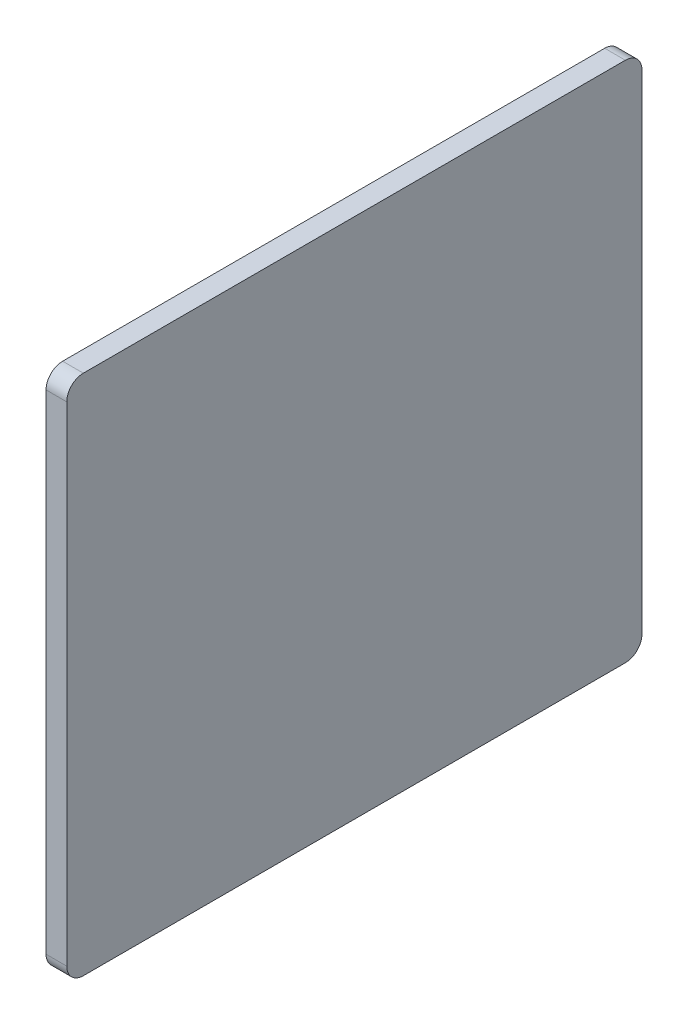
ISO-10303-21;
HEADER;
FILE_DESCRIPTION(('STEP AP214'),'2;1');
FILE_NAME('part.step','',(''),(''),'','','');
FILE_SCHEMA(('AUTOMOTIVE_DESIGN { 1 0 10303 214 1 1 1 1 }'));
ENDSEC;
DATA;
#1=APPLICATION_CONTEXT('core data for automotive mechanical design processes');
#2=APPLICATION_PROTOCOL_DEFINITION('international standard','automotive_design',2000,#1);
#3=PRODUCT_CONTEXT('',#1,'mechanical');
#4=PRODUCT('Part','Part','',(#3));
#5=PRODUCT_RELATED_PRODUCT_CATEGORY('part','',(#4));
#6=PRODUCT_DEFINITION_FORMATION('','',#4);
#7=PRODUCT_DEFINITION_CONTEXT('part definition',#1,'design');
#8=PRODUCT_DEFINITION('design','',#6,#7);
#9=PRODUCT_DEFINITION_SHAPE('','',#8);
#10=(LENGTH_UNIT() NAMED_UNIT(*) SI_UNIT(.MILLI.,.METRE.));
#11=(NAMED_UNIT(*) PLANE_ANGLE_UNIT() SI_UNIT($,.RADIAN.));
#12=(NAMED_UNIT(*) SI_UNIT($,.STERADIAN.) SOLID_ANGLE_UNIT());
#13=UNCERTAINTY_MEASURE_WITH_UNIT(LENGTH_MEASURE(1.E-05),#10,'distance_accuracy_value','');
#14=(GEOMETRIC_REPRESENTATION_CONTEXT(3) GLOBAL_UNCERTAINTY_ASSIGNED_CONTEXT((#13)) GLOBAL_UNIT_ASSIGNED_CONTEXT((#10,
#11,#12)) REPRESENTATION_CONTEXT('',''));
#15=CARTESIAN_POINT('',(0.,0.,0.));
#16=DIRECTION('',(0.,0.,1.));
#17=DIRECTION('',(1.,0.,0.));
#18=AXIS2_PLACEMENT_3D('',#15,#16,#17);
#19=CARTESIAN_POINT('',(3.175,-40.,44.0875));
#20=DIRECTION('',(0.,0.,-1.));
#21=DIRECTION('',(-1.,0.,0.));
#22=AXIS2_PLACEMENT_3D('',#19,#20,#21);
#23=PLANE('',#22);
#24=DIRECTION('',(0.,-1.,0.));
#25=VECTOR('',#24,1.);
#26=CARTESIAN_POINT('',(0.,-40.,44.0875));
#27=LINE('',#26,#25);
#28=CARTESIAN_POINT('',(0.,37.46,44.0875));
#29=VERTEX_POINT('',#28);
#30=CARTESIAN_POINT('',(0.,-37.46,44.0875));
#31=VERTEX_POINT('',#30);
#32=EDGE_CURVE('E139',#29,#31,#27,.T.);
#33=ORIENTED_EDGE('',*,*,#32,.T.);
#34=DIRECTION('',(-1.,0.,0.));
#35=VECTOR('',#34,1.);
#36=CARTESIAN_POINT('',(3.175,-37.46,44.0875));
#37=LINE('',#36,#35);
#38=CARTESIAN_POINT('',(3.175,-37.46,44.0875));
#39=VERTEX_POINT('',#38);
#40=EDGE_CURVE('E114',#31,#39,#37,.F.);
#41=ORIENTED_EDGE('',*,*,#40,.T.);
#42=DIRECTION('',(0.,-1.,0.));
#43=VECTOR('',#42,1.);
#44=CARTESIAN_POINT('',(3.175,-40.,44.0875));
#45=LINE('',#44,#43);
#46=CARTESIAN_POINT('',(3.175,37.46,44.0875));
#47=VERTEX_POINT('',#46);
#48=EDGE_CURVE('E151',#47,#39,#45,.T.);
#49=ORIENTED_EDGE('',*,*,#48,.F.);
#50=DIRECTION('',(-1.,0.,0.));
#51=VECTOR('',#50,1.);
#52=CARTESIAN_POINT('',(3.175,37.46,44.0875));
#53=LINE('',#52,#51);
#54=EDGE_CURVE('E120',#47,#29,#53,.T.);
#55=ORIENTED_EDGE('',*,*,#54,.T.);
#56=EDGE_LOOP('',(#33,#41,#49,#55));
#57=FACE_BOUND('',#56,.T.);
#58=ADVANCED_FACE('F42',(#57),#23,.F.);
#59=CARTESIAN_POINT('',(3.175,-40.,-44.0875));
#60=DIRECTION('',(0.,1.,0.));
#61=DIRECTION('',(0.,0.,1.));
#62=AXIS2_PLACEMENT_3D('',#59,#60,#61);
#63=PLANE('',#62);
#64=DIRECTION('',(0.,0.,-1.));
#65=VECTOR('',#64,1.);
#66=CARTESIAN_POINT('',(3.175,-40.,-44.0875));
#67=LINE('',#66,#65);
#68=CARTESIAN_POINT('',(3.175,-40.,41.5475));
#69=VERTEX_POINT('',#68);
#70=CARTESIAN_POINT('',(3.175,-40.,-41.5475));
#71=VERTEX_POINT('',#70);
#72=EDGE_CURVE('E130',#69,#71,#67,.T.);
#73=ORIENTED_EDGE('',*,*,#72,.F.);
#74=DIRECTION('',(-1.,0.,0.));
#75=VECTOR('',#74,1.);
#76=CARTESIAN_POINT('',(3.175,-40.,41.5475));
#77=LINE('',#76,#75);
#78=CARTESIAN_POINT('',(0.,-40.,41.5475));
#79=VERTEX_POINT('',#78);
#80=EDGE_CURVE('E113',#69,#79,#77,.T.);
#81=ORIENTED_EDGE('',*,*,#80,.T.);
#82=DIRECTION('',(0.,0.,-1.));
#83=VECTOR('',#82,1.);
#84=CARTESIAN_POINT('',(0.,-40.,-44.0875));
#85=LINE('',#84,#83);
#86=CARTESIAN_POINT('',(0.,-40.,-41.5475));
#87=VERTEX_POINT('',#86);
#88=EDGE_CURVE('E127',#79,#87,#85,.T.);
#89=ORIENTED_EDGE('',*,*,#88,.T.);
#90=DIRECTION('',(-1.,0.,0.));
#91=VECTOR('',#90,1.);
#92=CARTESIAN_POINT('',(3.175,-40.,-41.5475));
#93=LINE('',#92,#91);
#94=EDGE_CURVE('E133',#87,#71,#93,.F.);
#95=ORIENTED_EDGE('',*,*,#94,.T.);
#96=EDGE_LOOP('',(#73,#81,#89,#95));
#97=FACE_BOUND('',#96,.T.);
#98=ADVANCED_FACE('F126',(#97),#63,.F.);
#99=CARTESIAN_POINT('',(3.175,-40.,-44.0875));
#100=DIRECTION('',(0.,0.,1.));
#101=DIRECTION('',(1.,0.,0.));
#102=AXIS2_PLACEMENT_3D('',#99,#100,#101);
#103=PLANE('',#102);
#104=DIRECTION('',(0.,1.,0.));
#105=VECTOR('',#104,1.);
#106=CARTESIAN_POINT('',(3.175,-40.,-44.0875));
#107=LINE('',#106,#105);
#108=CARTESIAN_POINT('',(3.175,-37.46,-44.0875));
#109=VERTEX_POINT('',#108);
#110=CARTESIAN_POINT('',(3.175,37.46,-44.0875));
#111=VERTEX_POINT('',#110);
#112=EDGE_CURVE('E187',#109,#111,#107,.T.);
#113=ORIENTED_EDGE('',*,*,#112,.F.);
#114=DIRECTION('',(-1.,0.,0.));
#115=VECTOR('',#114,1.);
#116=CARTESIAN_POINT('',(3.175,-37.46,-44.0875));
#117=LINE('',#116,#115);
#118=CARTESIAN_POINT('',(0.,-37.46,-44.0875));
#119=VERTEX_POINT('',#118);
#120=EDGE_CURVE('E181',#109,#119,#117,.T.);
#121=ORIENTED_EDGE('',*,*,#120,.T.);
#122=DIRECTION('',(0.,1.,0.));
#123=VECTOR('',#122,1.);
#124=CARTESIAN_POINT('',(0.,-40.,-44.0875));
#125=LINE('',#124,#123);
#126=CARTESIAN_POINT('',(0.,37.46,-44.0875));
#127=VERTEX_POINT('',#126);
#128=EDGE_CURVE('E138',#119,#127,#125,.T.);
#129=ORIENTED_EDGE('',*,*,#128,.T.);
#130=DIRECTION('',(-1.,0.,0.));
#131=VECTOR('',#130,1.);
#132=CARTESIAN_POINT('',(3.175,37.46,-44.0875));
#133=LINE('',#132,#131);
#134=EDGE_CURVE('E178',#127,#111,#133,.F.);
#135=ORIENTED_EDGE('',*,*,#134,.T.);
#136=EDGE_LOOP('',(#113,#121,#129,#135));
#137=FACE_BOUND('',#136,.T.);
#138=ADVANCED_FACE('F208',(#137),#103,.F.);
#139=CARTESIAN_POINT('',(3.175,40.,-44.0875));
#140=DIRECTION('',(0.,-1.,0.));
#141=DIRECTION('',(0.,0.,-1.));
#142=AXIS2_PLACEMENT_3D('',#139,#140,#141);
#143=PLANE('',#142);
#144=DIRECTION('',(0.,0.,1.));
#145=VECTOR('',#144,1.);
#146=CARTESIAN_POINT('',(3.175,40.,-44.0875));
#147=LINE('',#146,#145);
#148=CARTESIAN_POINT('',(3.175,40.,-41.5475));
#149=VERTEX_POINT('',#148);
#150=CARTESIAN_POINT('',(3.175,40.,41.5475));
#151=VERTEX_POINT('',#150);
#152=EDGE_CURVE('E153',#149,#151,#147,.T.);
#153=ORIENTED_EDGE('',*,*,#152,.F.);
#154=DIRECTION('',(-1.,0.,0.));
#155=VECTOR('',#154,1.);
#156=CARTESIAN_POINT('',(3.175,40.,-41.5475));
#157=LINE('',#156,#155);
#158=CARTESIAN_POINT('',(0.,40.,-41.5475));
#159=VERTEX_POINT('',#158);
#160=EDGE_CURVE('E11',#149,#159,#157,.T.);
#161=ORIENTED_EDGE('',*,*,#160,.T.);
#162=DIRECTION('',(0.,0.,1.));
#163=VECTOR('',#162,1.);
#164=CARTESIAN_POINT('',(0.,40.,-44.0875));
#165=LINE('',#164,#163);
#166=CARTESIAN_POINT('',(0.,40.,41.5475));
#167=VERTEX_POINT('',#166);
#168=EDGE_CURVE('E144',#159,#167,#165,.T.);
#169=ORIENTED_EDGE('',*,*,#168,.T.);
#170=DIRECTION('',(-1.,0.,0.));
#171=VECTOR('',#170,1.);
#172=CARTESIAN_POINT('',(3.175,40.,41.5475));
#173=LINE('',#172,#171);
#174=EDGE_CURVE('E51',#167,#151,#173,.F.);
#175=ORIENTED_EDGE('',*,*,#174,.T.);
#176=EDGE_LOOP('',(#153,#161,#169,#175));
#177=FACE_BOUND('',#176,.T.);
#178=ADVANCED_FACE('F201',(#177),#143,.F.);
#179=CARTESIAN_POINT('',(3.175,0.,0.));
#180=DIRECTION('',(1.,0.,0.));
#181=DIRECTION('',(0.,0.,-1.));
#182=AXIS2_PLACEMENT_3D('',#179,#180,#181);
#183=PLANE('',#182);
#184=ORIENTED_EDGE('',*,*,#48,.T.);
#185=CARTESIAN_POINT('',(3.175,-37.46,41.5475));
#186=DIRECTION('',(1.,0.,0.));
#187=DIRECTION('',(0.,0.,-1.));
#188=AXIS2_PLACEMENT_3D('',#185,#186,#187);
#189=CIRCLE('',#188,2.54);
#190=EDGE_CURVE('E175',#39,#69,#189,.T.);
#191=ORIENTED_EDGE('',*,*,#190,.T.);
#192=ORIENTED_EDGE('',*,*,#72,.T.);
#193=CARTESIAN_POINT('',(3.175,-37.46,-41.5475));
#194=DIRECTION('',(1.,0.,0.));
#195=DIRECTION('',(0.,0.,-1.));
#196=AXIS2_PLACEMENT_3D('',#193,#194,#195);
#197=CIRCLE('',#196,2.54);
#198=EDGE_CURVE('E172',#71,#109,#197,.T.);
#199=ORIENTED_EDGE('',*,*,#198,.T.);
#200=ORIENTED_EDGE('',*,*,#112,.T.);
#201=CARTESIAN_POINT('',(3.175,37.46,-41.5475));
#202=DIRECTION('',(1.,0.,0.));
#203=DIRECTION('',(0.,0.,-1.));
#204=AXIS2_PLACEMENT_3D('',#201,#202,#203);
#205=CIRCLE('',#204,2.54);
#206=EDGE_CURVE('E64',#111,#149,#205,.T.);
#207=ORIENTED_EDGE('',*,*,#206,.T.);
#208=ORIENTED_EDGE('',*,*,#152,.T.);
#209=CARTESIAN_POINT('',(3.175,37.46,41.5475));
#210=DIRECTION('',(1.,0.,0.));
#211=DIRECTION('',(0.,0.,-1.));
#212=AXIS2_PLACEMENT_3D('',#209,#210,#211);
#213=CIRCLE('',#212,2.54);
#214=EDGE_CURVE('E167',#151,#47,#213,.T.);
#215=ORIENTED_EDGE('',*,*,#214,.T.);
#216=EDGE_LOOP('',(#184,#191,#192,#199,#200,#207,#208,#215));
#217=FACE_BOUND('',#216,.T.);
#218=ADVANCED_FACE('F195',(#217),#183,.T.);
#219=CARTESIAN_POINT('',(0.,0.,0.));
#220=DIRECTION('',(1.,0.,0.));
#221=DIRECTION('',(0.,0.,-1.));
#222=AXIS2_PLACEMENT_3D('',#219,#220,#221);
#223=PLANE('',#222);
#224=ORIENTED_EDGE('',*,*,#88,.F.);
#225=CARTESIAN_POINT('',(0.,-37.46,41.5475));
#226=DIRECTION('',(1.,0.,0.));
#227=DIRECTION('',(0.,0.,-1.));
#228=AXIS2_PLACEMENT_3D('',#225,#226,#227);
#229=CIRCLE('',#228,2.54);
#230=EDGE_CURVE('E109',#79,#31,#229,.F.);
#231=ORIENTED_EDGE('',*,*,#230,.T.);
#232=ORIENTED_EDGE('',*,*,#32,.F.);
#233=CARTESIAN_POINT('',(0.,37.46,41.5475));
#234=DIRECTION('',(1.,0.,0.));
#235=DIRECTION('',(0.,0.,-1.));
#236=AXIS2_PLACEMENT_3D('',#233,#234,#235);
#237=CIRCLE('',#236,2.54);
#238=EDGE_CURVE('E132',#29,#167,#237,.F.);
#239=ORIENTED_EDGE('',*,*,#238,.T.);
#240=ORIENTED_EDGE('',*,*,#168,.F.);
#241=CARTESIAN_POINT('',(0.,37.46,-41.5475));
#242=DIRECTION('',(1.,0.,0.));
#243=DIRECTION('',(0.,0.,-1.));
#244=AXIS2_PLACEMENT_3D('',#241,#242,#243);
#245=CIRCLE('',#244,2.54);
#246=EDGE_CURVE('E157',#159,#127,#245,.F.);
#247=ORIENTED_EDGE('',*,*,#246,.T.);
#248=ORIENTED_EDGE('',*,*,#128,.F.);
#249=CARTESIAN_POINT('',(0.,-37.46,-41.5475));
#250=DIRECTION('',(1.,0.,0.));
#251=DIRECTION('',(0.,0.,-1.));
#252=AXIS2_PLACEMENT_3D('',#249,#250,#251);
#253=CIRCLE('',#252,2.54);
#254=EDGE_CURVE('E121',#119,#87,#253,.F.);
#255=ORIENTED_EDGE('',*,*,#254,.T.);
#256=EDGE_LOOP('',(#224,#231,#232,#239,#240,#247,#248,#255));
#257=FACE_BOUND('',#256,.T.);
#258=ADVANCED_FACE('F135',(#257),#223,.F.);
#259=CARTESIAN_POINT('',(3.175,-37.46,41.5475));
#260=DIRECTION('',(-1.,0.,0.));
#261=DIRECTION('',(0.,0.,1.));
#262=AXIS2_PLACEMENT_3D('',#259,#260,#261);
#263=CYLINDRICAL_SURFACE('',#262,2.54);
#264=ORIENTED_EDGE('',*,*,#190,.F.);
#265=ORIENTED_EDGE('',*,*,#40,.F.);
#266=ORIENTED_EDGE('',*,*,#230,.F.);
#267=ORIENTED_EDGE('',*,*,#80,.F.);
#268=EDGE_LOOP('',(#264,#265,#266,#267));
#269=FACE_BOUND('',#268,.T.);
#270=ADVANCED_FACE('F112',(#269),#263,.T.);
#271=CARTESIAN_POINT('',(3.175,-37.46,-41.5475));
#272=DIRECTION('',(-1.,0.,0.));
#273=DIRECTION('',(0.,0.,1.));
#274=AXIS2_PLACEMENT_3D('',#271,#272,#273);
#275=CYLINDRICAL_SURFACE('',#274,2.54);
#276=ORIENTED_EDGE('',*,*,#198,.F.);
#277=ORIENTED_EDGE('',*,*,#94,.F.);
#278=ORIENTED_EDGE('',*,*,#254,.F.);
#279=ORIENTED_EDGE('',*,*,#120,.F.);
#280=EDGE_LOOP('',(#276,#277,#278,#279));
#281=FACE_BOUND('',#280,.T.);
#282=ADVANCED_FACE('F212',(#281),#275,.T.);
#283=CARTESIAN_POINT('',(3.175,37.46,-41.5475));
#284=DIRECTION('',(-1.,0.,0.));
#285=DIRECTION('',(0.,0.,1.));
#286=AXIS2_PLACEMENT_3D('',#283,#284,#285);
#287=CYLINDRICAL_SURFACE('',#286,2.54);
#288=ORIENTED_EDGE('',*,*,#206,.F.);
#289=ORIENTED_EDGE('',*,*,#134,.F.);
#290=ORIENTED_EDGE('',*,*,#246,.F.);
#291=ORIENTED_EDGE('',*,*,#160,.F.);
#292=EDGE_LOOP('',(#288,#289,#290,#291));
#293=FACE_BOUND('',#292,.T.);
#294=ADVANCED_FACE('F204',(#293),#287,.T.);
#295=CARTESIAN_POINT('',(3.175,37.46,41.5475));
#296=DIRECTION('',(-1.,0.,0.));
#297=DIRECTION('',(0.,0.,1.));
#298=AXIS2_PLACEMENT_3D('',#295,#296,#297);
#299=CYLINDRICAL_SURFACE('',#298,2.54);
#300=ORIENTED_EDGE('',*,*,#214,.F.);
#301=ORIENTED_EDGE('',*,*,#174,.F.);
#302=ORIENTED_EDGE('',*,*,#238,.F.);
#303=ORIENTED_EDGE('',*,*,#54,.F.);
#304=EDGE_LOOP('',(#300,#301,#302,#303));
#305=FACE_BOUND('',#304,.T.);
#306=ADVANCED_FACE('F44',(#305),#299,.T.);
#307=CLOSED_SHELL('',(#58,#98,#138,#178,#218,#258,#270,#282,#294,#306));
#308=MANIFOLD_SOLID_BREP('B2',#307);
#309=ADVANCED_BREP_SHAPE_REPRESENTATION('',(#18,#308),#14);
#310=SHAPE_DEFINITION_REPRESENTATION(#9,#309);
ENDSEC;
END-ISO-10303-21;
